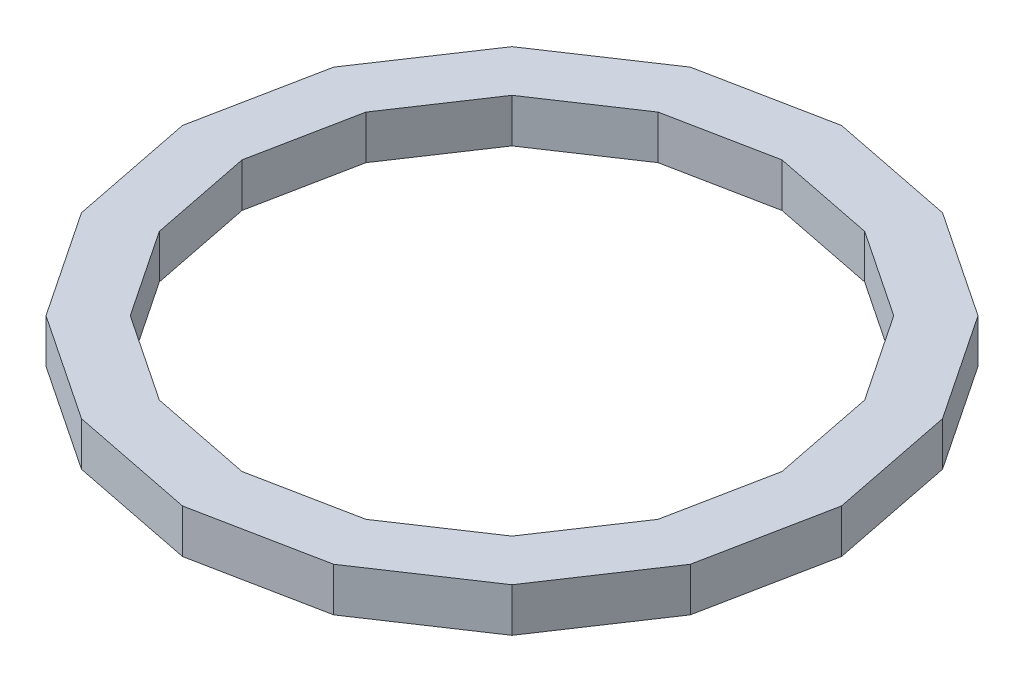
ISO-10303-21;
HEADER;
FILE_DESCRIPTION(('STEP AP214'),'2;1');
FILE_NAME('part.step','',(''),(''),'','','');
FILE_SCHEMA(('AUTOMOTIVE_DESIGN { 1 0 10303 214 1 1 1 1 }'));
ENDSEC;
DATA;
#1=APPLICATION_CONTEXT('core data for automotive mechanical design processes');
#2=APPLICATION_PROTOCOL_DEFINITION('international standard','automotive_design',2000,#1);
#3=PRODUCT_CONTEXT('',#1,'mechanical');
#4=PRODUCT('Part','Part','',(#3));
#5=PRODUCT_RELATED_PRODUCT_CATEGORY('part','',(#4));
#6=PRODUCT_DEFINITION_FORMATION('','',#4);
#7=PRODUCT_DEFINITION_CONTEXT('part definition',#1,'design');
#8=PRODUCT_DEFINITION('design','',#6,#7);
#9=PRODUCT_DEFINITION_SHAPE('','',#8);
#10=(LENGTH_UNIT() NAMED_UNIT(*) SI_UNIT(.MILLI.,.METRE.));
#11=(NAMED_UNIT(*) PLANE_ANGLE_UNIT() SI_UNIT($,.RADIAN.));
#12=(NAMED_UNIT(*) SI_UNIT($,.STERADIAN.) SOLID_ANGLE_UNIT());
#13=UNCERTAINTY_MEASURE_WITH_UNIT(LENGTH_MEASURE(1.E-05),#10,'distance_accuracy_value','');
#14=(GEOMETRIC_REPRESENTATION_CONTEXT(3) GLOBAL_UNCERTAINTY_ASSIGNED_CONTEXT((#13)) GLOBAL_UNIT_ASSIGNED_CONTEXT((#10,
#11,#12)) REPRESENTATION_CONTEXT('',''));
#15=CARTESIAN_POINT('',(0.,0.,0.));
#16=DIRECTION('',(0.,0.,1.));
#17=DIRECTION('',(1.,0.,0.));
#18=AXIS2_PLACEMENT_3D('',#15,#16,#17);
#19=CARTESIAN_POINT('',(0.,19.05,0.));
#20=DIRECTION('',(0.,1.,0.));
#21=DIRECTION('',(0.,0.,1.));
#22=AXIS2_PLACEMENT_3D('',#19,#20,#21);
#23=PLANE('',#22);
#24=DIRECTION('',(0.195090322016119,0.,-0.980785280403232));
#25=VECTOR('',#24,1.);
#26=CARTESIAN_POINT('',(132.314068025535,19.05,54.8062814689311));
#27=LINE('',#26,#25);
#28=CARTESIAN_POINT('',(132.314068025535,19.05,54.8062814689311));
#29=VERTEX_POINT('',#28);
#30=CARTESIAN_POINT('',(143.215715219795,19.05,-1.33227912968946E-12));
#31=VERTEX_POINT('',#30);
#32=EDGE_CURVE('E387',#29,#31,#27,.T.);
#33=ORIENTED_EDGE('',*,*,#32,.T.);
#34=DIRECTION('',(-0.195090322016138,0.,-0.980785280403229));
#35=VECTOR('',#34,1.);
#36=CARTESIAN_POINT('',(143.215715219795,19.05,-1.33227912968946E-12));
#37=LINE('',#36,#35);
#38=CARTESIAN_POINT('',(132.314068025533,19.05,-54.8062814689337));
#39=VERTEX_POINT('',#38);
#40=EDGE_CURVE('E391',#31,#39,#37,.T.);
#41=ORIENTED_EDGE('',*,*,#40,.T.);
#42=DIRECTION('',(-0.555570233019611,0.,-0.83146961230254));
#43=VECTOR('',#42,1.);
#44=CARTESIAN_POINT('',(132.314068025533,19.05,-54.8062814689337));
#45=LINE('',#44,#43);
#46=CARTESIAN_POINT('',(101.268803404398,19.05,-101.2688034044));
#47=VERTEX_POINT('',#46);
#48=EDGE_CURVE('E395',#39,#47,#45,.T.);
#49=ORIENTED_EDGE('',*,*,#48,.T.);
#50=DIRECTION('',(-0.831469612302551,0.,-0.555570233019594));
#51=VECTOR('',#50,1.);
#52=CARTESIAN_POINT('',(101.268803404398,19.05,-101.2688034044));
#53=LINE('',#52,#51);
#54=CARTESIAN_POINT('',(54.8062814689311,19.05,-132.314068025534));
#55=VERTEX_POINT('',#54);
#56=EDGE_CURVE('E398',#47,#55,#53,.T.);
#57=ORIENTED_EDGE('',*,*,#56,.T.);
#58=DIRECTION('',(-0.980785280403233,0.,-0.195090322016118));
#59=VECTOR('',#58,1.);
#60=CARTESIAN_POINT('',(54.8062814689311,19.05,-132.314068025534));
#61=LINE('',#60,#59);
#62=CARTESIAN_POINT('',(-1.41502138351388E-12,19.05,-143.215715219795));
#63=VERTEX_POINT('',#62);
#64=EDGE_CURVE('E401',#55,#63,#61,.T.);
#65=ORIENTED_EDGE('',*,*,#64,.T.);
#66=DIRECTION('',(-0.980785280403229,0.,0.195090322016138));
#67=VECTOR('',#66,1.);
#68=CARTESIAN_POINT('',(-1.41502138351388E-12,19.05,-143.215715219795));
#69=LINE('',#68,#67);
#70=CARTESIAN_POINT('',(-54.8062814689337,19.05,-132.314068025533));
#71=VERTEX_POINT('',#70);
#72=EDGE_CURVE('E404',#63,#71,#69,.T.);
#73=ORIENTED_EDGE('',*,*,#72,.T.);
#74=DIRECTION('',(-0.83146961230254,0.,0.55557023301961));
#75=VECTOR('',#74,1.);
#76=CARTESIAN_POINT('',(-54.8062814689337,19.05,-132.314068025533));
#77=LINE('',#76,#75);
#78=CARTESIAN_POINT('',(-101.2688034044,19.05,-101.268803404398));
#79=VERTEX_POINT('',#78);
#80=EDGE_CURVE('E406',#71,#79,#77,.T.);
#81=ORIENTED_EDGE('',*,*,#80,.T.);
#82=DIRECTION('',(-0.555570233019594,0.,0.831469612302551));
#83=VECTOR('',#82,1.);
#84=CARTESIAN_POINT('',(-101.2688034044,19.05,-101.268803404398));
#85=LINE('',#84,#83);
#86=CARTESIAN_POINT('',(-132.314068025534,19.05,-54.806281468931));
#87=VERTEX_POINT('',#86);
#88=EDGE_CURVE('E408',#79,#87,#85,.T.);
#89=ORIENTED_EDGE('',*,*,#88,.T.);
#90=DIRECTION('',(-0.195090322016118,0.,0.980785280403233));
#91=VECTOR('',#90,1.);
#92=CARTESIAN_POINT('',(-132.314068025534,19.05,-54.806281468931));
#93=LINE('',#92,#91);
#94=CARTESIAN_POINT('',(-143.215715219795,19.05,1.47046340656723E-12));
#95=VERTEX_POINT('',#94);
#96=EDGE_CURVE('E410',#87,#95,#93,.T.);
#97=ORIENTED_EDGE('',*,*,#96,.T.);
#98=DIRECTION('',(0.195090322016138,0.,0.980785280403229));
#99=VECTOR('',#98,1.);
#100=CARTESIAN_POINT('',(-143.215715219795,19.05,1.47046340656723E-12));
#101=LINE('',#100,#99);
#102=CARTESIAN_POINT('',(-132.314068025533,19.05,54.8062814689337));
#103=VERTEX_POINT('',#102);
#104=EDGE_CURVE('E412',#95,#103,#101,.T.);
#105=ORIENTED_EDGE('',*,*,#104,.T.);
#106=DIRECTION('',(0.555570233019611,0.,0.83146961230254));
#107=VECTOR('',#106,1.);
#108=CARTESIAN_POINT('',(-132.314068025533,19.05,54.8062814689337));
#109=LINE('',#108,#107);
#110=CARTESIAN_POINT('',(-101.268803404398,19.05,101.2688034044));
#111=VERTEX_POINT('',#110);
#112=EDGE_CURVE('E414',#103,#111,#109,.T.);
#113=ORIENTED_EDGE('',*,*,#112,.T.);
#114=DIRECTION('',(0.831469612302551,0.,0.555570233019594));
#115=VECTOR('',#114,1.);
#116=CARTESIAN_POINT('',(-101.268803404398,19.05,101.2688034044));
#117=LINE('',#116,#115);
#118=CARTESIAN_POINT('',(-54.8062814689311,19.05,132.314068025534));
#119=VERTEX_POINT('',#118);
#120=EDGE_CURVE('E416',#111,#119,#117,.T.);
#121=ORIENTED_EDGE('',*,*,#120,.T.);
#122=DIRECTION('',(0.980785280403233,0.,0.195090322016118));
#123=VECTOR('',#122,1.);
#124=CARTESIAN_POINT('',(-54.8062814689311,19.05,132.314068025534));
#125=LINE('',#124,#123);
#126=CARTESIAN_POINT('',(1.44060583007305E-12,19.05,143.215715219795));
#127=VERTEX_POINT('',#126);
#128=EDGE_CURVE('E418',#119,#127,#125,.T.);
#129=ORIENTED_EDGE('',*,*,#128,.T.);
#130=DIRECTION('',(0.980785280403229,0.,-0.195090322016138));
#131=VECTOR('',#130,1.);
#132=CARTESIAN_POINT('',(1.44060583007305E-12,19.05,143.215715219795));
#133=LINE('',#132,#131);
#134=CARTESIAN_POINT('',(54.8062814689338,19.05,132.314068025533));
#135=VERTEX_POINT('',#134);
#136=EDGE_CURVE('E420',#127,#135,#133,.T.);
#137=ORIENTED_EDGE('',*,*,#136,.T.);
#138=DIRECTION('',(0.83146961230254,0.,-0.555570233019611));
#139=VECTOR('',#138,1.);
#140=CARTESIAN_POINT('',(54.8062814689338,19.05,132.314068025533));
#141=LINE('',#140,#139);
#142=CARTESIAN_POINT('',(101.2688034044,19.05,101.268803404398));
#143=VERTEX_POINT('',#142);
#144=EDGE_CURVE('E422',#135,#143,#141,.T.);
#145=ORIENTED_EDGE('',*,*,#144,.T.);
#146=DIRECTION('',(0.555570233019594,0.,-0.831469612302551));
#147=VECTOR('',#146,1.);
#148=CARTESIAN_POINT('',(101.2688034044,19.05,101.268803404398));
#149=LINE('',#148,#147);
#150=EDGE_CURVE('E424',#143,#29,#149,.T.);
#151=ORIENTED_EDGE('',*,*,#150,.T.);
#152=EDGE_LOOP('',(#33,#41,#49,#57,#65,#73,#81,#89,#97,#105,#113,#121,#129,#137,#145,#151));
#153=FACE_BOUND('',#152,.T.);
#154=DIRECTION('',(-0.195090322016138,0.,-0.980785280403228));
#155=VECTOR('',#154,1.);
#156=CARTESIAN_POINT('',(117.318099801304,19.05,-1.27657928212033E-12));
#157=LINE('',#156,#155);
#158=CARTESIAN_POINT('',(117.318099801304,19.05,-1.27657928212033E-12));
#159=VERTEX_POINT('',#158);
#160=CARTESIAN_POINT('',(108.387791199541,19.05,-44.8956931105142));
#161=VERTEX_POINT('',#160);
#162=EDGE_CURVE('E252',#159,#161,#157,.T.);
#163=ORIENTED_EDGE('',*,*,#162,.F.);
#164=DIRECTION('',(0.195090322016118,0.,-0.980785280403233));
#165=VECTOR('',#164,1.);
#166=CARTESIAN_POINT('',(108.387791199542,19.05,44.8956931105121));
#167=LINE('',#166,#165);
#168=CARTESIAN_POINT('',(108.387791199542,19.05,44.8956931105121));
#169=VERTEX_POINT('',#168);
#170=EDGE_CURVE('E244',#169,#159,#167,.T.);
#171=ORIENTED_EDGE('',*,*,#170,.F.);
#172=DIRECTION('',(0.555570233019594,0.,-0.831469612302551));
#173=VECTOR('',#172,1.);
#174=CARTESIAN_POINT('',(82.956423925423,19.05,82.9564239254212));
#175=LINE('',#174,#173);
#176=CARTESIAN_POINT('',(82.956423925423,19.05,82.9564239254212));
#177=VERTEX_POINT('',#176);
#178=EDGE_CURVE('E303',#177,#169,#175,.T.);
#179=ORIENTED_EDGE('',*,*,#178,.F.);
#180=DIRECTION('',(0.83146961230254,0.,-0.555570233019611));
#181=VECTOR('',#180,1.);
#182=CARTESIAN_POINT('',(44.8956931105142,19.05,108.387791199541));
#183=LINE('',#182,#181);
#184=CARTESIAN_POINT('',(44.8956931105142,19.05,108.387791199541));
#185=VERTEX_POINT('',#184);
#186=EDGE_CURVE('E300',#185,#177,#183,.T.);
#187=ORIENTED_EDGE('',*,*,#186,.F.);
#188=DIRECTION('',(0.980785280403228,0.,-0.195090322016138));
#189=VECTOR('',#188,1.);
#190=CARTESIAN_POINT('',(1.22266987130559E-12,19.05,117.318099801304));
#191=LINE('',#190,#189);
#192=CARTESIAN_POINT('',(1.22266987130559E-12,19.05,117.318099801304));
#193=VERTEX_POINT('',#192);
#194=EDGE_CURVE('E298',#193,#185,#191,.T.);
#195=ORIENTED_EDGE('',*,*,#194,.F.);
#196=DIRECTION('',(0.980785280403232,0.,0.195090322016118));
#197=VECTOR('',#196,1.);
#198=CARTESIAN_POINT('',(-44.895693110512,19.05,108.387791199542));
#199=LINE('',#198,#197);
#200=CARTESIAN_POINT('',(-44.895693110512,19.05,108.387791199542));
#201=VERTEX_POINT('',#200);
#202=EDGE_CURVE('E296',#201,#193,#199,.T.);
#203=ORIENTED_EDGE('',*,*,#202,.F.);
#204=DIRECTION('',(0.831469612302551,0.,0.555570233019594));
#205=VECTOR('',#204,1.);
#206=CARTESIAN_POINT('',(-82.9564239254213,19.05,82.956423925423));
#207=LINE('',#206,#205);
#208=CARTESIAN_POINT('',(-82.9564239254213,19.05,82.956423925423));
#209=VERTEX_POINT('',#208);
#210=EDGE_CURVE('E293',#209,#201,#207,.T.);
#211=ORIENTED_EDGE('',*,*,#210,.F.);
#212=DIRECTION('',(0.555570233019611,0.,0.831469612302539));
#213=VECTOR('',#212,1.);
#214=CARTESIAN_POINT('',(-108.387791199541,19.05,44.8956931105142));
#215=LINE('',#214,#213);
#216=CARTESIAN_POINT('',(-108.387791199541,19.05,44.8956931105142));
#217=VERTEX_POINT('',#216);
#218=EDGE_CURVE('E291',#217,#209,#215,.T.);
#219=ORIENTED_EDGE('',*,*,#218,.F.);
#220=DIRECTION('',(0.195090322016138,0.,0.980785280403228));
#221=VECTOR('',#220,1.);
#222=CARTESIAN_POINT('',(-117.318099801304,19.05,1.28933217815806E-12));
#223=LINE('',#222,#221);
#224=CARTESIAN_POINT('',(-117.318099801304,19.05,1.28933217815806E-12));
#225=VERTEX_POINT('',#224);
#226=EDGE_CURVE('E289',#225,#217,#223,.T.);
#227=ORIENTED_EDGE('',*,*,#226,.F.);
#228=DIRECTION('',(-0.195090322016118,0.,0.980785280403233));
#229=VECTOR('',#228,1.);
#230=CARTESIAN_POINT('',(-108.387791199542,19.05,-44.895693110512));
#231=LINE('',#230,#229);
#232=CARTESIAN_POINT('',(-108.387791199542,19.05,-44.895693110512));
#233=VERTEX_POINT('',#232);
#234=EDGE_CURVE('E287',#233,#225,#231,.T.);
#235=ORIENTED_EDGE('',*,*,#234,.F.);
#236=DIRECTION('',(-0.555570233019594,0.,0.831469612302551));
#237=VECTOR('',#236,1.);
#238=CARTESIAN_POINT('',(-82.9564239254229,19.05,-82.9564239254212));
#239=LINE('',#238,#237);
#240=CARTESIAN_POINT('',(-82.9564239254229,19.05,-82.9564239254212));
#241=VERTEX_POINT('',#240);
#242=EDGE_CURVE('E285',#241,#233,#239,.T.);
#243=ORIENTED_EDGE('',*,*,#242,.F.);
#244=DIRECTION('',(-0.831469612302539,0.,0.555570233019611));
#245=VECTOR('',#244,1.);
#246=CARTESIAN_POINT('',(-44.8956931105143,19.05,-108.387791199541));
#247=LINE('',#246,#245);
#248=CARTESIAN_POINT('',(-44.8956931105143,19.05,-108.387791199541));
#249=VERTEX_POINT('',#248);
#250=EDGE_CURVE('E283',#249,#241,#247,.T.);
#251=ORIENTED_EDGE('',*,*,#250,.F.);
#252=DIRECTION('',(-0.980785280403229,0.,0.195090322016138));
#253=VECTOR('',#252,1.);
#254=CARTESIAN_POINT('',(-1.26404060994794E-12,19.05,-117.318099801304));
#255=LINE('',#254,#253);
#256=CARTESIAN_POINT('',(-1.26404060994794E-12,19.05,-117.318099801304));
#257=VERTEX_POINT('',#256);
#258=EDGE_CURVE('E281',#257,#249,#255,.T.);
#259=ORIENTED_EDGE('',*,*,#258,.F.);
#260=DIRECTION('',(-0.980785280403233,0.,-0.195090322016118));
#261=VECTOR('',#260,1.);
#262=CARTESIAN_POINT('',(44.8956931105121,19.05,-108.387791199541));
#263=LINE('',#262,#261);
#264=CARTESIAN_POINT('',(44.8956931105121,19.05,-108.387791199541));
#265=VERTEX_POINT('',#264);
#266=EDGE_CURVE('E278',#265,#257,#263,.T.);
#267=ORIENTED_EDGE('',*,*,#266,.F.);
#268=DIRECTION('',(-0.831469612302551,0.,-0.555570233019594));
#269=VECTOR('',#268,1.);
#270=CARTESIAN_POINT('',(82.9564239254212,19.05,-82.956423925423));
#271=LINE('',#270,#269);
#272=CARTESIAN_POINT('',(82.9564239254212,19.05,-82.956423925423));
#273=VERTEX_POINT('',#272);
#274=EDGE_CURVE('E273',#273,#265,#271,.T.);
#275=ORIENTED_EDGE('',*,*,#274,.F.);
#276=DIRECTION('',(-0.555570233019611,0.,-0.831469612302539));
#277=VECTOR('',#276,1.);
#278=CARTESIAN_POINT('',(108.387791199541,19.05,-44.8956931105142));
#279=LINE('',#278,#277);
#280=EDGE_CURVE('E266',#161,#273,#279,.T.);
#281=ORIENTED_EDGE('',*,*,#280,.F.);
#282=EDGE_LOOP('',(#163,#171,#179,#187,#195,#203,#211,#219,#227,#235,#243,#251,#259,#267,#275,#281));
#283=FACE_BOUND('',#282,.T.);
#284=ADVANCED_FACE('F35',(#153,#283),#23,.T.);
#285=CARTESIAN_POINT('',(0.,0.,0.));
#286=DIRECTION('',(0.,1.,0.));
#287=DIRECTION('',(0.,0.,1.));
#288=AXIS2_PLACEMENT_3D('',#285,#286,#287);
#289=PLANE('',#288);
#290=DIRECTION('',(0.195090322016119,0.,-0.980785280403232));
#291=VECTOR('',#290,1.);
#292=CARTESIAN_POINT('',(132.314068025535,0.,54.8062814689311));
#293=LINE('',#292,#291);
#294=CARTESIAN_POINT('',(132.314068025535,0.,54.8062814689311));
#295=VERTEX_POINT('',#294);
#296=CARTESIAN_POINT('',(143.215715219795,0.,-1.33227912968946E-12));
#297=VERTEX_POINT('',#296);
#298=EDGE_CURVE('E261',#295,#297,#293,.T.);
#299=ORIENTED_EDGE('',*,*,#298,.F.);
#300=DIRECTION('',(0.555570233019594,0.,-0.831469612302551));
#301=VECTOR('',#300,1.);
#302=CARTESIAN_POINT('',(101.2688034044,0.,101.268803404398));
#303=LINE('',#302,#301);
#304=CARTESIAN_POINT('',(101.2688034044,0.,101.268803404398));
#305=VERTEX_POINT('',#304);
#306=EDGE_CURVE('E392',#305,#295,#303,.T.);
#307=ORIENTED_EDGE('',*,*,#306,.F.);
#308=DIRECTION('',(0.83146961230254,0.,-0.555570233019611));
#309=VECTOR('',#308,1.);
#310=CARTESIAN_POINT('',(54.8062814689338,0.,132.314068025533));
#311=LINE('',#310,#309);
#312=CARTESIAN_POINT('',(54.8062814689338,0.,132.314068025533));
#313=VERTEX_POINT('',#312);
#314=EDGE_CURVE('E466',#313,#305,#311,.T.);
#315=ORIENTED_EDGE('',*,*,#314,.F.);
#316=DIRECTION('',(0.980785280403229,0.,-0.195090322016138));
#317=VECTOR('',#316,1.);
#318=CARTESIAN_POINT('',(1.44060583007305E-12,0.,143.215715219795));
#319=LINE('',#318,#317);
#320=CARTESIAN_POINT('',(1.44060583007305E-12,0.,143.215715219795));
#321=VERTEX_POINT('',#320);
#322=EDGE_CURVE('E463',#321,#313,#319,.T.);
#323=ORIENTED_EDGE('',*,*,#322,.F.);
#324=DIRECTION('',(0.980785280403233,0.,0.195090322016118));
#325=VECTOR('',#324,1.);
#326=CARTESIAN_POINT('',(-54.8062814689311,0.,132.314068025534));
#327=LINE('',#326,#325);
#328=CARTESIAN_POINT('',(-54.8062814689311,0.,132.314068025534));
#329=VERTEX_POINT('',#328);
#330=EDGE_CURVE('E460',#329,#321,#327,.T.);
#331=ORIENTED_EDGE('',*,*,#330,.F.);
#332=DIRECTION('',(0.831469612302551,0.,0.555570233019594));
#333=VECTOR('',#332,1.);
#334=CARTESIAN_POINT('',(-101.268803404398,0.,101.2688034044));
#335=LINE('',#334,#333);
#336=CARTESIAN_POINT('',(-101.268803404398,0.,101.2688034044));
#337=VERTEX_POINT('',#336);
#338=EDGE_CURVE('E457',#337,#329,#335,.T.);
#339=ORIENTED_EDGE('',*,*,#338,.F.);
#340=DIRECTION('',(0.555570233019611,0.,0.83146961230254));
#341=VECTOR('',#340,1.);
#342=CARTESIAN_POINT('',(-132.314068025533,0.,54.8062814689337));
#343=LINE('',#342,#341);
#344=CARTESIAN_POINT('',(-132.314068025533,0.,54.8062814689337));
#345=VERTEX_POINT('',#344);
#346=EDGE_CURVE('E454',#345,#337,#343,.T.);
#347=ORIENTED_EDGE('',*,*,#346,.F.);
#348=DIRECTION('',(0.195090322016138,0.,0.980785280403229));
#349=VECTOR('',#348,1.);
#350=CARTESIAN_POINT('',(-143.215715219795,0.,1.47046340656723E-12));
#351=LINE('',#350,#349);
#352=CARTESIAN_POINT('',(-143.215715219795,0.,1.47046340656723E-12));
#353=VERTEX_POINT('',#352);
#354=EDGE_CURVE('E452',#353,#345,#351,.T.);
#355=ORIENTED_EDGE('',*,*,#354,.F.);
#356=DIRECTION('',(-0.195090322016118,0.,0.980785280403233));
#357=VECTOR('',#356,1.);
#358=CARTESIAN_POINT('',(-132.314068025534,0.,-54.806281468931));
#359=LINE('',#358,#357);
#360=CARTESIAN_POINT('',(-132.314068025534,0.,-54.806281468931));
#361=VERTEX_POINT('',#360);
#362=EDGE_CURVE('E449',#361,#353,#359,.T.);
#363=ORIENTED_EDGE('',*,*,#362,.F.);
#364=DIRECTION('',(-0.555570233019594,0.,0.831469612302551));
#365=VECTOR('',#364,1.);
#366=CARTESIAN_POINT('',(-101.2688034044,0.,-101.268803404398));
#367=LINE('',#366,#365);
#368=CARTESIAN_POINT('',(-101.2688034044,0.,-101.268803404398));
#369=VERTEX_POINT('',#368);
#370=EDGE_CURVE('E447',#369,#361,#367,.T.);
#371=ORIENTED_EDGE('',*,*,#370,.F.);
#372=DIRECTION('',(-0.83146961230254,0.,0.55557023301961));
#373=VECTOR('',#372,1.);
#374=CARTESIAN_POINT('',(-54.8062814689337,0.,-132.314068025533));
#375=LINE('',#374,#373);
#376=CARTESIAN_POINT('',(-54.8062814689337,0.,-132.314068025533));
#377=VERTEX_POINT('',#376);
#378=EDGE_CURVE('E445',#377,#369,#375,.T.);
#379=ORIENTED_EDGE('',*,*,#378,.F.);
#380=DIRECTION('',(-0.980785280403229,0.,0.195090322016138));
#381=VECTOR('',#380,1.);
#382=CARTESIAN_POINT('',(-1.41502138351388E-12,0.,-143.215715219795));
#383=LINE('',#382,#381);
#384=CARTESIAN_POINT('',(-1.41502138351388E-12,0.,-143.215715219795));
#385=VERTEX_POINT('',#384);
#386=EDGE_CURVE('E443',#385,#377,#383,.T.);
#387=ORIENTED_EDGE('',*,*,#386,.F.);
#388=DIRECTION('',(-0.980785280403233,0.,-0.195090322016118));
#389=VECTOR('',#388,1.);
#390=CARTESIAN_POINT('',(54.8062814689311,0.,-132.314068025534));
#391=LINE('',#390,#389);
#392=CARTESIAN_POINT('',(54.8062814689311,0.,-132.314068025534));
#393=VERTEX_POINT('',#392);
#394=EDGE_CURVE('E440',#393,#385,#391,.T.);
#395=ORIENTED_EDGE('',*,*,#394,.F.);
#396=DIRECTION('',(-0.831469612302551,0.,-0.555570233019594));
#397=VECTOR('',#396,1.);
#398=CARTESIAN_POINT('',(101.268803404398,0.,-101.2688034044));
#399=LINE('',#398,#397);
#400=CARTESIAN_POINT('',(101.268803404398,0.,-101.2688034044));
#401=VERTEX_POINT('',#400);
#402=EDGE_CURVE('E437',#401,#393,#399,.T.);
#403=ORIENTED_EDGE('',*,*,#402,.F.);
#404=DIRECTION('',(-0.555570233019611,0.,-0.83146961230254));
#405=VECTOR('',#404,1.);
#406=CARTESIAN_POINT('',(132.314068025533,0.,-54.8062814689337));
#407=LINE('',#406,#405);
#408=CARTESIAN_POINT('',(132.314068025533,0.,-54.8062814689337));
#409=VERTEX_POINT('',#408);
#410=EDGE_CURVE('E434',#409,#401,#407,.T.);
#411=ORIENTED_EDGE('',*,*,#410,.F.);
#412=DIRECTION('',(-0.195090322016138,0.,-0.980785280403229));
#413=VECTOR('',#412,1.);
#414=CARTESIAN_POINT('',(143.215715219795,0.,-1.33227912968946E-12));
#415=LINE('',#414,#413);
#416=EDGE_CURVE('E431',#297,#409,#415,.T.);
#417=ORIENTED_EDGE('',*,*,#416,.F.);
#418=EDGE_LOOP('',(#299,#307,#315,#323,#331,#339,#347,#355,#363,#371,#379,#387,#395,#403,#411,#417));
#419=FACE_BOUND('',#418,.T.);
#420=DIRECTION('',(0.195090322016118,0.,-0.980785280403233));
#421=VECTOR('',#420,1.);
#422=CARTESIAN_POINT('',(108.387791199542,0.,44.8956931105121));
#423=LINE('',#422,#421);
#424=CARTESIAN_POINT('',(108.387791199542,0.,44.8956931105121));
#425=VERTEX_POINT('',#424);
#426=CARTESIAN_POINT('',(117.318099801304,0.,-1.27657928212033E-12));
#427=VERTEX_POINT('',#426);
#428=EDGE_CURVE('E58',#425,#427,#423,.T.);
#429=ORIENTED_EDGE('',*,*,#428,.T.);
#430=DIRECTION('',(-0.195090322016138,0.,-0.980785280403228));
#431=VECTOR('',#430,1.);
#432=CARTESIAN_POINT('',(117.318099801304,0.,-1.27657928212033E-12));
#433=LINE('',#432,#431);
#434=CARTESIAN_POINT('',(108.387791199541,0.,-44.8956931105142));
#435=VERTEX_POINT('',#434);
#436=EDGE_CURVE('E259',#427,#435,#433,.T.);
#437=ORIENTED_EDGE('',*,*,#436,.T.);
#438=DIRECTION('',(-0.555570233019611,0.,-0.831469612302539));
#439=VECTOR('',#438,1.);
#440=CARTESIAN_POINT('',(108.387791199541,0.,-44.8956931105142));
#441=LINE('',#440,#439);
#442=CARTESIAN_POINT('',(82.9564239254212,0.,-82.956423925423));
#443=VERTEX_POINT('',#442);
#444=EDGE_CURVE('E310',#435,#443,#441,.T.);
#445=ORIENTED_EDGE('',*,*,#444,.T.);
#446=DIRECTION('',(-0.831469612302551,0.,-0.555570233019594));
#447=VECTOR('',#446,1.);
#448=CARTESIAN_POINT('',(82.9564239254212,0.,-82.956423925423));
#449=LINE('',#448,#447);
#450=CARTESIAN_POINT('',(44.8956931105121,0.,-108.387791199541));
#451=VERTEX_POINT('',#450);
#452=EDGE_CURVE('E314',#443,#451,#449,.T.);
#453=ORIENTED_EDGE('',*,*,#452,.T.);
#454=DIRECTION('',(-0.980785280403233,0.,-0.195090322016118));
#455=VECTOR('',#454,1.);
#456=CARTESIAN_POINT('',(44.8956931105121,0.,-108.387791199541));
#457=LINE('',#456,#455);
#458=CARTESIAN_POINT('',(-1.26404060994794E-12,0.,-117.318099801304));
#459=VERTEX_POINT('',#458);
#460=EDGE_CURVE('E318',#451,#459,#457,.T.);
#461=ORIENTED_EDGE('',*,*,#460,.T.);
#462=DIRECTION('',(-0.980785280403229,0.,0.195090322016138));
#463=VECTOR('',#462,1.);
#464=CARTESIAN_POINT('',(-1.26404060994794E-12,0.,-117.318099801304));
#465=LINE('',#464,#463);
#466=CARTESIAN_POINT('',(-44.8956931105143,0.,-108.387791199541));
#467=VERTEX_POINT('',#466);
#468=EDGE_CURVE('E322',#459,#467,#465,.T.);
#469=ORIENTED_EDGE('',*,*,#468,.T.);
#470=DIRECTION('',(-0.831469612302539,0.,0.555570233019611));
#471=VECTOR('',#470,1.);
#472=CARTESIAN_POINT('',(-44.8956931105143,0.,-108.387791199541));
#473=LINE('',#472,#471);
#474=CARTESIAN_POINT('',(-82.9564239254229,0.,-82.9564239254212));
#475=VERTEX_POINT('',#474);
#476=EDGE_CURVE('E325',#467,#475,#473,.T.);
#477=ORIENTED_EDGE('',*,*,#476,.T.);
#478=DIRECTION('',(-0.555570233019594,0.,0.831469612302551));
#479=VECTOR('',#478,1.);
#480=CARTESIAN_POINT('',(-82.9564239254229,0.,-82.9564239254212));
#481=LINE('',#480,#479);
#482=CARTESIAN_POINT('',(-108.387791199542,0.,-44.895693110512));
#483=VERTEX_POINT('',#482);
#484=EDGE_CURVE('E329',#475,#483,#481,.T.);
#485=ORIENTED_EDGE('',*,*,#484,.T.);
#486=DIRECTION('',(-0.195090322016118,0.,0.980785280403233));
#487=VECTOR('',#486,1.);
#488=CARTESIAN_POINT('',(-108.387791199542,0.,-44.895693110512));
#489=LINE('',#488,#487);
#490=CARTESIAN_POINT('',(-117.318099801304,0.,1.28933217815806E-12));
#491=VERTEX_POINT('',#490);
#492=EDGE_CURVE('E332',#483,#491,#489,.T.);
#493=ORIENTED_EDGE('',*,*,#492,.T.);
#494=DIRECTION('',(0.195090322016138,0.,0.980785280403228));
#495=VECTOR('',#494,1.);
#496=CARTESIAN_POINT('',(-117.318099801304,0.,1.28933217815806E-12));
#497=LINE('',#496,#495);
#498=CARTESIAN_POINT('',(-108.387791199541,0.,44.8956931105142));
#499=VERTEX_POINT('',#498);
#500=EDGE_CURVE('E336',#491,#499,#497,.T.);
#501=ORIENTED_EDGE('',*,*,#500,.T.);
#502=DIRECTION('',(0.555570233019611,0.,0.831469612302539));
#503=VECTOR('',#502,1.);
#504=CARTESIAN_POINT('',(-108.387791199541,0.,44.8956931105142));
#505=LINE('',#504,#503);
#506=CARTESIAN_POINT('',(-82.9564239254213,0.,82.956423925423));
#507=VERTEX_POINT('',#506);
#508=EDGE_CURVE('E339',#499,#507,#505,.T.);
#509=ORIENTED_EDGE('',*,*,#508,.T.);
#510=DIRECTION('',(0.831469612302551,0.,0.555570233019594));
#511=VECTOR('',#510,1.);
#512=CARTESIAN_POINT('',(-82.9564239254213,0.,82.956423925423));
#513=LINE('',#512,#511);
#514=CARTESIAN_POINT('',(-44.895693110512,0.,108.387791199542));
#515=VERTEX_POINT('',#514);
#516=EDGE_CURVE('E343',#507,#515,#513,.T.);
#517=ORIENTED_EDGE('',*,*,#516,.T.);
#518=DIRECTION('',(0.980785280403232,0.,0.195090322016118));
#519=VECTOR('',#518,1.);
#520=CARTESIAN_POINT('',(-44.895693110512,0.,108.387791199542));
#521=LINE('',#520,#519);
#522=CARTESIAN_POINT('',(1.22266987130559E-12,0.,117.318099801304));
#523=VERTEX_POINT('',#522);
#524=EDGE_CURVE('E346',#515,#523,#521,.T.);
#525=ORIENTED_EDGE('',*,*,#524,.T.);
#526=DIRECTION('',(0.980785280403228,0.,-0.195090322016138));
#527=VECTOR('',#526,1.);
#528=CARTESIAN_POINT('',(1.22266987130559E-12,0.,117.318099801304));
#529=LINE('',#528,#527);
#530=CARTESIAN_POINT('',(44.8956931105142,0.,108.387791199541));
#531=VERTEX_POINT('',#530);
#532=EDGE_CURVE('E349',#523,#531,#529,.T.);
#533=ORIENTED_EDGE('',*,*,#532,.T.);
#534=DIRECTION('',(0.83146961230254,0.,-0.555570233019611));
#535=VECTOR('',#534,1.);
#536=CARTESIAN_POINT('',(44.8956931105142,0.,108.387791199541));
#537=LINE('',#536,#535);
#538=CARTESIAN_POINT('',(82.956423925423,0.,82.9564239254212));
#539=VERTEX_POINT('',#538);
#540=EDGE_CURVE('E352',#531,#539,#537,.T.);
#541=ORIENTED_EDGE('',*,*,#540,.T.);
#542=DIRECTION('',(0.555570233019594,0.,-0.831469612302551));
#543=VECTOR('',#542,1.);
#544=CARTESIAN_POINT('',(82.956423925423,0.,82.9564239254212));
#545=LINE('',#544,#543);
#546=EDGE_CURVE('E253',#539,#425,#545,.T.);
#547=ORIENTED_EDGE('',*,*,#546,.T.);
#548=EDGE_LOOP('',(#429,#437,#445,#453,#461,#469,#477,#485,#493,#501,#509,#517,#525,#533,#541,#547));
#549=FACE_BOUND('',#548,.T.);
#550=ADVANCED_FACE('F528',(#419,#549),#289,.F.);
#551=CARTESIAN_POINT('',(132.314068025535,19.05,54.8062814689311));
#552=DIRECTION('',(-0.980785280403232,0.,-0.195090322016119));
#553=DIRECTION('',(-0.195090322016119,0.,0.980785280403232));
#554=AXIS2_PLACEMENT_3D('',#551,#552,#553);
#555=PLANE('',#554);
#556=ORIENTED_EDGE('',*,*,#298,.T.);
#557=DIRECTION('',(0.,-1.,0.));
#558=VECTOR('',#557,1.);
#559=CARTESIAN_POINT('',(143.215715219795,19.05,-1.33227912968946E-12));
#560=LINE('',#559,#558);
#561=EDGE_CURVE('E11',#31,#297,#560,.T.);
#562=ORIENTED_EDGE('',*,*,#561,.F.);
#563=ORIENTED_EDGE('',*,*,#32,.F.);
#564=DIRECTION('',(0.,-1.,0.));
#565=VECTOR('',#564,1.);
#566=CARTESIAN_POINT('',(132.314068025535,19.05,54.8062814689311));
#567=LINE('',#566,#565);
#568=EDGE_CURVE('E427',#29,#295,#567,.T.);
#569=ORIENTED_EDGE('',*,*,#568,.T.);
#570=EDGE_LOOP('',(#556,#562,#563,#569));
#571=FACE_BOUND('',#570,.T.);
#572=ADVANCED_FACE('F37',(#571),#555,.F.);
#573=CARTESIAN_POINT('',(143.215715219795,19.05,-1.33227912968946E-12));
#574=DIRECTION('',(-0.980785280403228,0.,0.195090322016138));
#575=DIRECTION('',(0.195090322016138,0.,0.980785280403228));
#576=AXIS2_PLACEMENT_3D('',#573,#574,#575);
#577=PLANE('',#576);
#578=ORIENTED_EDGE('',*,*,#416,.T.);
#579=DIRECTION('',(0.,-1.,0.));
#580=VECTOR('',#579,1.);
#581=CARTESIAN_POINT('',(132.314068025533,19.05,-54.8062814689337));
#582=LINE('',#581,#580);
#583=EDGE_CURVE('E43',#39,#409,#582,.T.);
#584=ORIENTED_EDGE('',*,*,#583,.F.);
#585=ORIENTED_EDGE('',*,*,#40,.F.);
#586=ORIENTED_EDGE('',*,*,#561,.T.);
#587=EDGE_LOOP('',(#578,#584,#585,#586));
#588=FACE_BOUND('',#587,.T.);
#589=ADVANCED_FACE('F545',(#588),#577,.F.);
#590=CARTESIAN_POINT('',(132.314068025533,19.05,-54.8062814689337));
#591=DIRECTION('',(-0.83146961230254,0.,0.555570233019611));
#592=DIRECTION('',(0.555570233019611,0.,0.83146961230254));
#593=AXIS2_PLACEMENT_3D('',#590,#591,#592);
#594=PLANE('',#593);
#595=ORIENTED_EDGE('',*,*,#410,.T.);
#596=DIRECTION('',(0.,-1.,0.));
#597=VECTOR('',#596,1.);
#598=CARTESIAN_POINT('',(101.268803404398,19.05,-101.2688034044));
#599=LINE('',#598,#597);
#600=EDGE_CURVE('E511',#47,#401,#599,.T.);
#601=ORIENTED_EDGE('',*,*,#600,.F.);
#602=ORIENTED_EDGE('',*,*,#48,.F.);
#603=ORIENTED_EDGE('',*,*,#583,.T.);
#604=EDGE_LOOP('',(#595,#601,#602,#603));
#605=FACE_BOUND('',#604,.T.);
#606=ADVANCED_FACE('F522',(#605),#594,.F.);
#607=CARTESIAN_POINT('',(101.268803404398,19.05,-101.2688034044));
#608=DIRECTION('',(-0.555570233019594,0.,0.831469612302551));
#609=DIRECTION('',(0.831469612302551,0.,0.555570233019594));
#610=AXIS2_PLACEMENT_3D('',#607,#608,#609);
#611=PLANE('',#610);
#612=ORIENTED_EDGE('',*,*,#402,.T.);
#613=DIRECTION('',(0.,-1.,0.));
#614=VECTOR('',#613,1.);
#615=CARTESIAN_POINT('',(54.8062814689311,19.05,-132.314068025534));
#616=LINE('',#615,#614);
#617=EDGE_CURVE('E507',#55,#393,#616,.T.);
#618=ORIENTED_EDGE('',*,*,#617,.F.);
#619=ORIENTED_EDGE('',*,*,#56,.F.);
#620=ORIENTED_EDGE('',*,*,#600,.T.);
#621=EDGE_LOOP('',(#612,#618,#619,#620));
#622=FACE_BOUND('',#621,.T.);
#623=ADVANCED_FACE('F534',(#622),#611,.F.);
#624=CARTESIAN_POINT('',(54.8062814689311,19.05,-132.314068025534));
#625=DIRECTION('',(-0.195090322016118,0.,0.980785280403232));
#626=DIRECTION('',(0.980785280403232,0.,0.195090322016118));
#627=AXIS2_PLACEMENT_3D('',#624,#625,#626);
#628=PLANE('',#627);
#629=ORIENTED_EDGE('',*,*,#394,.T.);
#630=DIRECTION('',(0.,-1.,0.));
#631=VECTOR('',#630,1.);
#632=CARTESIAN_POINT('',(-1.41502138351388E-12,19.05,-143.215715219795));
#633=LINE('',#632,#631);
#634=EDGE_CURVE('E504',#63,#385,#633,.T.);
#635=ORIENTED_EDGE('',*,*,#634,.F.);
#636=ORIENTED_EDGE('',*,*,#64,.F.);
#637=ORIENTED_EDGE('',*,*,#617,.T.);
#638=EDGE_LOOP('',(#629,#635,#636,#637));
#639=FACE_BOUND('',#638,.T.);
#640=ADVANCED_FACE('F538',(#639),#628,.F.);
#641=CARTESIAN_POINT('',(-1.41502138351388E-12,19.05,-143.215715219795));
#642=DIRECTION('',(0.195090322016138,0.,0.980785280403228));
#643=DIRECTION('',(0.980785280403229,0.,-0.195090322016138));
#644=AXIS2_PLACEMENT_3D('',#641,#642,#643);
#645=PLANE('',#644);
#646=ORIENTED_EDGE('',*,*,#386,.T.);
#647=DIRECTION('',(0.,-1.,0.));
#648=VECTOR('',#647,1.);
#649=CARTESIAN_POINT('',(-54.8062814689337,19.05,-132.314068025533));
#650=LINE('',#649,#648);
#651=EDGE_CURVE('E501',#71,#377,#650,.T.);
#652=ORIENTED_EDGE('',*,*,#651,.F.);
#653=ORIENTED_EDGE('',*,*,#72,.F.);
#654=ORIENTED_EDGE('',*,*,#634,.T.);
#655=EDGE_LOOP('',(#646,#652,#653,#654));
#656=FACE_BOUND('',#655,.T.);
#657=ADVANCED_FACE('F598',(#656),#645,.F.);
#658=CARTESIAN_POINT('',(-54.8062814689337,19.05,-132.314068025533));
#659=DIRECTION('',(0.55557023301961,0.,0.83146961230254));
#660=DIRECTION('',(0.83146961230254,0.,-0.55557023301961));
#661=AXIS2_PLACEMENT_3D('',#658,#659,#660);
#662=PLANE('',#661);
#663=ORIENTED_EDGE('',*,*,#378,.T.);
#664=DIRECTION('',(0.,-1.,0.));
#665=VECTOR('',#664,1.);
#666=CARTESIAN_POINT('',(-101.2688034044,19.05,-101.268803404398));
#667=LINE('',#666,#665);
#668=EDGE_CURVE('E498',#79,#369,#667,.T.);
#669=ORIENTED_EDGE('',*,*,#668,.F.);
#670=ORIENTED_EDGE('',*,*,#80,.F.);
#671=ORIENTED_EDGE('',*,*,#651,.T.);
#672=EDGE_LOOP('',(#663,#669,#670,#671));
#673=FACE_BOUND('',#672,.T.);
#674=ADVANCED_FACE('F595',(#673),#662,.F.);
#675=CARTESIAN_POINT('',(-101.2688034044,19.05,-101.268803404398));
#676=DIRECTION('',(0.831469612302551,0.,0.555570233019594));
#677=DIRECTION('',(0.555570233019594,0.,-0.831469612302551));
#678=AXIS2_PLACEMENT_3D('',#675,#676,#677);
#679=PLANE('',#678);
#680=ORIENTED_EDGE('',*,*,#370,.T.);
#681=DIRECTION('',(0.,-1.,0.));
#682=VECTOR('',#681,1.);
#683=CARTESIAN_POINT('',(-132.314068025534,19.05,-54.806281468931));
#684=LINE('',#683,#682);
#685=EDGE_CURVE('E495',#87,#361,#684,.T.);
#686=ORIENTED_EDGE('',*,*,#685,.F.);
#687=ORIENTED_EDGE('',*,*,#88,.F.);
#688=ORIENTED_EDGE('',*,*,#668,.T.);
#689=EDGE_LOOP('',(#680,#686,#687,#688));
#690=FACE_BOUND('',#689,.T.);
#691=ADVANCED_FACE('F591',(#690),#679,.F.);
#692=CARTESIAN_POINT('',(-132.314068025534,19.05,-54.806281468931));
#693=DIRECTION('',(0.980785280403232,0.,0.195090322016118));
#694=DIRECTION('',(0.195090322016118,0.,-0.980785280403233));
#695=AXIS2_PLACEMENT_3D('',#692,#693,#694);
#696=PLANE('',#695);
#697=ORIENTED_EDGE('',*,*,#362,.T.);
#698=DIRECTION('',(0.,-1.,0.));
#699=VECTOR('',#698,1.);
#700=CARTESIAN_POINT('',(-143.215715219795,19.05,1.47046340656723E-12));
#701=LINE('',#700,#699);
#702=EDGE_CURVE('E492',#95,#353,#701,.T.);
#703=ORIENTED_EDGE('',*,*,#702,.F.);
#704=ORIENTED_EDGE('',*,*,#96,.F.);
#705=ORIENTED_EDGE('',*,*,#685,.T.);
#706=EDGE_LOOP('',(#697,#703,#704,#705));
#707=FACE_BOUND('',#706,.T.);
#708=ADVANCED_FACE('F587',(#707),#696,.F.);
#709=CARTESIAN_POINT('',(-143.215715219795,19.05,1.47046340656723E-12));
#710=DIRECTION('',(0.980785280403229,0.,-0.195090322016138));
#711=DIRECTION('',(-0.195090322016138,0.,-0.980785280403229));
#712=AXIS2_PLACEMENT_3D('',#709,#710,#711);
#713=PLANE('',#712);
#714=ORIENTED_EDGE('',*,*,#354,.T.);
#715=DIRECTION('',(0.,-1.,0.));
#716=VECTOR('',#715,1.);
#717=CARTESIAN_POINT('',(-132.314068025533,19.05,54.8062814689337));
#718=LINE('',#717,#716);
#719=EDGE_CURVE('E489',#103,#345,#718,.T.);
#720=ORIENTED_EDGE('',*,*,#719,.F.);
#721=ORIENTED_EDGE('',*,*,#104,.F.);
#722=ORIENTED_EDGE('',*,*,#702,.T.);
#723=EDGE_LOOP('',(#714,#720,#721,#722));
#724=FACE_BOUND('',#723,.T.);
#725=ADVANCED_FACE('F582',(#724),#713,.F.);
#726=CARTESIAN_POINT('',(-132.314068025533,19.05,54.8062814689337));
#727=DIRECTION('',(0.83146961230254,0.,-0.555570233019611));
#728=DIRECTION('',(-0.555570233019611,0.,-0.83146961230254));
#729=AXIS2_PLACEMENT_3D('',#726,#727,#728);
#730=PLANE('',#729);
#731=ORIENTED_EDGE('',*,*,#346,.T.);
#732=DIRECTION('',(0.,-1.,0.));
#733=VECTOR('',#732,1.);
#734=CARTESIAN_POINT('',(-101.268803404398,19.05,101.2688034044));
#735=LINE('',#734,#733);
#736=EDGE_CURVE('E485',#111,#337,#735,.T.);
#737=ORIENTED_EDGE('',*,*,#736,.F.);
#738=ORIENTED_EDGE('',*,*,#112,.F.);
#739=ORIENTED_EDGE('',*,*,#719,.T.);
#740=EDGE_LOOP('',(#731,#737,#738,#739));
#741=FACE_BOUND('',#740,.T.);
#742=ADVANCED_FACE('F576',(#741),#730,.F.);
#743=CARTESIAN_POINT('',(-101.268803404398,19.05,101.2688034044));
#744=DIRECTION('',(0.555570233019594,0.,-0.831469612302551));
#745=DIRECTION('',(-0.831469612302551,0.,-0.555570233019594));
#746=AXIS2_PLACEMENT_3D('',#743,#744,#745);
#747=PLANE('',#746);
#748=ORIENTED_EDGE('',*,*,#338,.T.);
#749=DIRECTION('',(0.,-1.,0.));
#750=VECTOR('',#749,1.);
#751=CARTESIAN_POINT('',(-54.8062814689311,19.05,132.314068025534));
#752=LINE('',#751,#750);
#753=EDGE_CURVE('E481',#119,#329,#752,.T.);
#754=ORIENTED_EDGE('',*,*,#753,.F.);
#755=ORIENTED_EDGE('',*,*,#120,.F.);
#756=ORIENTED_EDGE('',*,*,#736,.T.);
#757=EDGE_LOOP('',(#748,#754,#755,#756));
#758=FACE_BOUND('',#757,.T.);
#759=ADVANCED_FACE('F572',(#758),#747,.F.);
#760=CARTESIAN_POINT('',(-54.8062814689311,19.05,132.314068025534));
#761=DIRECTION('',(0.195090322016118,0.,-0.980785280403232));
#762=DIRECTION('',(-0.980785280403232,0.,-0.195090322016118));
#763=AXIS2_PLACEMENT_3D('',#760,#761,#762);
#764=PLANE('',#763);
#765=ORIENTED_EDGE('',*,*,#330,.T.);
#766=DIRECTION('',(0.,-1.,0.));
#767=VECTOR('',#766,1.);
#768=CARTESIAN_POINT('',(1.44060583007305E-12,19.05,143.215715219795));
#769=LINE('',#768,#767);
#770=EDGE_CURVE('E478',#127,#321,#769,.T.);
#771=ORIENTED_EDGE('',*,*,#770,.F.);
#772=ORIENTED_EDGE('',*,*,#128,.F.);
#773=ORIENTED_EDGE('',*,*,#753,.T.);
#774=EDGE_LOOP('',(#765,#771,#772,#773));
#775=FACE_BOUND('',#774,.T.);
#776=ADVANCED_FACE('F567',(#775),#764,.F.);
#777=CARTESIAN_POINT('',(1.44060583007305E-12,19.05,143.215715219795));
#778=DIRECTION('',(-0.195090322016138,0.,-0.980785280403229));
#779=DIRECTION('',(-0.980785280403229,0.,0.195090322016138));
#780=AXIS2_PLACEMENT_3D('',#777,#778,#779);
#781=PLANE('',#780);
#782=ORIENTED_EDGE('',*,*,#322,.T.);
#783=DIRECTION('',(0.,-1.,0.));
#784=VECTOR('',#783,1.);
#785=CARTESIAN_POINT('',(54.8062814689338,19.05,132.314068025533));
#786=LINE('',#785,#784);
#787=EDGE_CURVE('E475',#135,#313,#786,.T.);
#788=ORIENTED_EDGE('',*,*,#787,.F.);
#789=ORIENTED_EDGE('',*,*,#136,.F.);
#790=ORIENTED_EDGE('',*,*,#770,.T.);
#791=EDGE_LOOP('',(#782,#788,#789,#790));
#792=FACE_BOUND('',#791,.T.);
#793=ADVANCED_FACE('F561',(#792),#781,.F.);
#794=CARTESIAN_POINT('',(54.8062814689338,19.05,132.314068025533));
#795=DIRECTION('',(-0.555570233019611,0.,-0.83146961230254));
#796=DIRECTION('',(-0.83146961230254,0.,0.555570233019611));
#797=AXIS2_PLACEMENT_3D('',#794,#795,#796);
#798=PLANE('',#797);
#799=ORIENTED_EDGE('',*,*,#314,.T.);
#800=DIRECTION('',(0.,-1.,0.));
#801=VECTOR('',#800,1.);
#802=CARTESIAN_POINT('',(101.2688034044,19.05,101.268803404398));
#803=LINE('',#802,#801);
#804=EDGE_CURVE('E472',#143,#305,#803,.T.);
#805=ORIENTED_EDGE('',*,*,#804,.F.);
#806=ORIENTED_EDGE('',*,*,#144,.F.);
#807=ORIENTED_EDGE('',*,*,#787,.T.);
#808=EDGE_LOOP('',(#799,#805,#806,#807));
#809=FACE_BOUND('',#808,.T.);
#810=ADVANCED_FACE('F557',(#809),#798,.F.);
#811=CARTESIAN_POINT('',(101.2688034044,19.05,101.268803404398));
#812=DIRECTION('',(-0.831469612302551,0.,-0.555570233019594));
#813=DIRECTION('',(-0.555570233019594,0.,0.831469612302551));
#814=AXIS2_PLACEMENT_3D('',#811,#812,#813);
#815=PLANE('',#814);
#816=ORIENTED_EDGE('',*,*,#306,.T.);
#817=ORIENTED_EDGE('',*,*,#568,.F.);
#818=ORIENTED_EDGE('',*,*,#150,.F.);
#819=ORIENTED_EDGE('',*,*,#804,.T.);
#820=EDGE_LOOP('',(#816,#817,#818,#819));
#821=FACE_BOUND('',#820,.T.);
#822=ADVANCED_FACE('F552',(#821),#815,.F.);
#823=CARTESIAN_POINT('',(108.387791199542,19.05,44.8956931105121));
#824=DIRECTION('',(-0.980785280403232,0.,-0.195090322016118));
#825=DIRECTION('',(-0.195090322016118,0.,0.980785280403232));
#826=AXIS2_PLACEMENT_3D('',#823,#824,#825);
#827=PLANE('',#826);
#828=ORIENTED_EDGE('',*,*,#428,.F.);
#829=DIRECTION('',(0.,-1.,0.));
#830=VECTOR('',#829,1.);
#831=CARTESIAN_POINT('',(108.387791199542,19.05,44.8956931105121));
#832=LINE('',#831,#830);
#833=EDGE_CURVE('E248',#169,#425,#832,.T.);
#834=ORIENTED_EDGE('',*,*,#833,.F.);
#835=ORIENTED_EDGE('',*,*,#170,.T.);
#836=DIRECTION('',(0.,-1.,0.));
#837=VECTOR('',#836,1.);
#838=CARTESIAN_POINT('',(117.318099801304,19.05,-1.27657928212033E-12));
#839=LINE('',#838,#837);
#840=EDGE_CURVE('E247',#159,#427,#839,.T.);
#841=ORIENTED_EDGE('',*,*,#840,.T.);
#842=EDGE_LOOP('',(#828,#834,#835,#841));
#843=FACE_BOUND('',#842,.T.);
#844=ADVANCED_FACE('F246',(#843),#827,.T.);
#845=CARTESIAN_POINT('',(117.318099801304,19.05,-1.27657928212033E-12));
#846=DIRECTION('',(-0.980785280403228,0.,0.195090322016138));
#847=DIRECTION('',(0.195090322016139,0.,0.980785280403229));
#848=AXIS2_PLACEMENT_3D('',#845,#846,#847);
#849=PLANE('',#848);
#850=ORIENTED_EDGE('',*,*,#436,.F.);
#851=ORIENTED_EDGE('',*,*,#840,.F.);
#852=ORIENTED_EDGE('',*,*,#162,.T.);
#853=DIRECTION('',(0.,-1.,0.));
#854=VECTOR('',#853,1.);
#855=CARTESIAN_POINT('',(108.387791199541,19.05,-44.8956931105142));
#856=LINE('',#855,#854);
#857=EDGE_CURVE('E262',#161,#435,#856,.T.);
#858=ORIENTED_EDGE('',*,*,#857,.T.);
#859=EDGE_LOOP('',(#850,#851,#852,#858));
#860=FACE_BOUND('',#859,.T.);
#861=ADVANCED_FACE('F256',(#860),#849,.T.);
#862=CARTESIAN_POINT('',(108.387791199541,19.05,-44.8956931105142));
#863=DIRECTION('',(-0.831469612302539,0.,0.555570233019611));
#864=DIRECTION('',(0.555570233019611,0.,0.831469612302539));
#865=AXIS2_PLACEMENT_3D('',#862,#863,#864);
#866=PLANE('',#865);
#867=ORIENTED_EDGE('',*,*,#444,.F.);
#868=ORIENTED_EDGE('',*,*,#857,.F.);
#869=ORIENTED_EDGE('',*,*,#280,.T.);
#870=DIRECTION('',(0.,-1.,0.));
#871=VECTOR('',#870,1.);
#872=CARTESIAN_POINT('',(82.9564239254212,19.05,-82.956423925423));
#873=LINE('',#872,#871);
#874=EDGE_CURVE('E383',#273,#443,#873,.T.);
#875=ORIENTED_EDGE('',*,*,#874,.T.);
#876=EDGE_LOOP('',(#867,#868,#869,#875));
#877=FACE_BOUND('',#876,.T.);
#878=ADVANCED_FACE('F680',(#877),#866,.T.);
#879=CARTESIAN_POINT('',(82.9564239254212,19.05,-82.956423925423));
#880=DIRECTION('',(-0.555570233019594,0.,0.831469612302551));
#881=DIRECTION('',(0.831469612302551,0.,0.555570233019594));
#882=AXIS2_PLACEMENT_3D('',#879,#880,#881);
#883=PLANE('',#882);
#884=ORIENTED_EDGE('',*,*,#452,.F.);
#885=ORIENTED_EDGE('',*,*,#874,.F.);
#886=ORIENTED_EDGE('',*,*,#274,.T.);
#887=DIRECTION('',(0.,-1.,0.));
#888=VECTOR('',#887,1.);
#889=CARTESIAN_POINT('',(44.8956931105121,19.05,-108.387791199541));
#890=LINE('',#889,#888);
#891=EDGE_CURVE('E381',#265,#451,#890,.T.);
#892=ORIENTED_EDGE('',*,*,#891,.T.);
#893=EDGE_LOOP('',(#884,#885,#886,#892));
#894=FACE_BOUND('',#893,.T.);
#895=ADVANCED_FACE('F686',(#894),#883,.T.);
#896=CARTESIAN_POINT('',(44.8956931105121,19.05,-108.387791199541));
#897=DIRECTION('',(-0.195090322016118,0.,0.980785280403233));
#898=DIRECTION('',(0.980785280403233,0.,0.195090322016118));
#899=AXIS2_PLACEMENT_3D('',#896,#897,#898);
#900=PLANE('',#899);
#901=ORIENTED_EDGE('',*,*,#460,.F.);
#902=ORIENTED_EDGE('',*,*,#891,.F.);
#903=ORIENTED_EDGE('',*,*,#266,.T.);
#904=DIRECTION('',(0.,-1.,0.));
#905=VECTOR('',#904,1.);
#906=CARTESIAN_POINT('',(-1.26404060994794E-12,19.05,-117.318099801304));
#907=LINE('',#906,#905);
#908=EDGE_CURVE('E379',#257,#459,#907,.T.);
#909=ORIENTED_EDGE('',*,*,#908,.T.);
#910=EDGE_LOOP('',(#901,#902,#903,#909));
#911=FACE_BOUND('',#910,.T.);
#912=ADVANCED_FACE('F694',(#911),#900,.T.);
#913=CARTESIAN_POINT('',(-1.26404060994794E-12,19.05,-117.318099801304));
#914=DIRECTION('',(0.195090322016138,0.,0.980785280403228));
#915=DIRECTION('',(0.980785280403229,0.,-0.195090322016138));
#916=AXIS2_PLACEMENT_3D('',#913,#914,#915);
#917=PLANE('',#916);
#918=ORIENTED_EDGE('',*,*,#468,.F.);
#919=ORIENTED_EDGE('',*,*,#908,.F.);
#920=ORIENTED_EDGE('',*,*,#258,.T.);
#921=DIRECTION('',(0.,-1.,0.));
#922=VECTOR('',#921,1.);
#923=CARTESIAN_POINT('',(-44.8956931105143,19.05,-108.387791199541));
#924=LINE('',#923,#922);
#925=EDGE_CURVE('E377',#249,#467,#924,.T.);
#926=ORIENTED_EDGE('',*,*,#925,.T.);
#927=EDGE_LOOP('',(#918,#919,#920,#926));
#928=FACE_BOUND('',#927,.T.);
#929=ADVANCED_FACE('F703',(#928),#917,.T.);
#930=CARTESIAN_POINT('',(-44.8956931105143,19.05,-108.387791199541));
#931=DIRECTION('',(0.555570233019611,0.,0.831469612302539));
#932=DIRECTION('',(0.831469612302539,0.,-0.555570233019611));
#933=AXIS2_PLACEMENT_3D('',#930,#931,#932);
#934=PLANE('',#933);
#935=ORIENTED_EDGE('',*,*,#476,.F.);
#936=ORIENTED_EDGE('',*,*,#925,.F.);
#937=ORIENTED_EDGE('',*,*,#250,.T.);
#938=DIRECTION('',(0.,-1.,0.));
#939=VECTOR('',#938,1.);
#940=CARTESIAN_POINT('',(-82.9564239254229,19.05,-82.9564239254212));
#941=LINE('',#940,#939);
#942=EDGE_CURVE('E375',#241,#475,#941,.T.);
#943=ORIENTED_EDGE('',*,*,#942,.T.);
#944=EDGE_LOOP('',(#935,#936,#937,#943));
#945=FACE_BOUND('',#944,.T.);
#946=ADVANCED_FACE('F710',(#945),#934,.T.);
#947=CARTESIAN_POINT('',(-82.9564239254229,19.05,-82.9564239254212));
#948=DIRECTION('',(0.831469612302551,0.,0.555570233019594));
#949=DIRECTION('',(0.555570233019594,0.,-0.831469612302551));
#950=AXIS2_PLACEMENT_3D('',#947,#948,#949);
#951=PLANE('',#950);
#952=ORIENTED_EDGE('',*,*,#484,.F.);
#953=ORIENTED_EDGE('',*,*,#942,.F.);
#954=ORIENTED_EDGE('',*,*,#242,.T.);
#955=DIRECTION('',(0.,-1.,0.));
#956=VECTOR('',#955,1.);
#957=CARTESIAN_POINT('',(-108.387791199542,19.05,-44.895693110512));
#958=LINE('',#957,#956);
#959=EDGE_CURVE('E373',#233,#483,#958,.T.);
#960=ORIENTED_EDGE('',*,*,#959,.T.);
#961=EDGE_LOOP('',(#952,#953,#954,#960));
#962=FACE_BOUND('',#961,.T.);
#963=ADVANCED_FACE('F718',(#962),#951,.T.);
#964=CARTESIAN_POINT('',(-108.387791199542,19.05,-44.895693110512));
#965=DIRECTION('',(0.980785280403233,0.,0.195090322016118));
#966=DIRECTION('',(0.195090322016118,0.,-0.980785280403233));
#967=AXIS2_PLACEMENT_3D('',#964,#965,#966);
#968=PLANE('',#967);
#969=ORIENTED_EDGE('',*,*,#492,.F.);
#970=ORIENTED_EDGE('',*,*,#959,.F.);
#971=ORIENTED_EDGE('',*,*,#234,.T.);
#972=DIRECTION('',(0.,-1.,0.));
#973=VECTOR('',#972,1.);
#974=CARTESIAN_POINT('',(-117.318099801304,19.05,1.28933217815806E-12));
#975=LINE('',#974,#973);
#976=EDGE_CURVE('E371',#225,#491,#975,.T.);
#977=ORIENTED_EDGE('',*,*,#976,.T.);
#978=EDGE_LOOP('',(#969,#970,#971,#977));
#979=FACE_BOUND('',#978,.T.);
#980=ADVANCED_FACE('F726',(#979),#968,.T.);
#981=CARTESIAN_POINT('',(-117.318099801304,19.05,1.28933217815806E-12));
#982=DIRECTION('',(0.980785280403229,0.,-0.195090322016138));
#983=DIRECTION('',(-0.195090322016138,0.,-0.980785280403229));
#984=AXIS2_PLACEMENT_3D('',#981,#982,#983);
#985=PLANE('',#984);
#986=ORIENTED_EDGE('',*,*,#500,.F.);
#987=ORIENTED_EDGE('',*,*,#976,.F.);
#988=ORIENTED_EDGE('',*,*,#226,.T.);
#989=DIRECTION('',(0.,-1.,0.));
#990=VECTOR('',#989,1.);
#991=CARTESIAN_POINT('',(-108.387791199541,19.05,44.8956931105142));
#992=LINE('',#991,#990);
#993=EDGE_CURVE('E369',#217,#499,#992,.T.);
#994=ORIENTED_EDGE('',*,*,#993,.T.);
#995=EDGE_LOOP('',(#986,#987,#988,#994));
#996=FACE_BOUND('',#995,.T.);
#997=ADVANCED_FACE('F733',(#996),#985,.T.);
#998=CARTESIAN_POINT('',(-108.387791199541,19.05,44.8956931105142));
#999=DIRECTION('',(0.831469612302539,0.,-0.555570233019611));
#1000=DIRECTION('',(-0.555570233019611,0.,-0.831469612302539));
#1001=AXIS2_PLACEMENT_3D('',#998,#999,#1000);
#1002=PLANE('',#1001);
#1003=ORIENTED_EDGE('',*,*,#508,.F.);
#1004=ORIENTED_EDGE('',*,*,#993,.F.);
#1005=ORIENTED_EDGE('',*,*,#218,.T.);
#1006=DIRECTION('',(0.,-1.,0.));
#1007=VECTOR('',#1006,1.);
#1008=CARTESIAN_POINT('',(-82.9564239254213,19.05,82.956423925423));
#1009=LINE('',#1008,#1007);
#1010=EDGE_CURVE('E367',#209,#507,#1009,.T.);
#1011=ORIENTED_EDGE('',*,*,#1010,.T.);
#1012=EDGE_LOOP('',(#1003,#1004,#1005,#1011));
#1013=FACE_BOUND('',#1012,.T.);
#1014=ADVANCED_FACE('F741',(#1013),#1002,.T.);
#1015=CARTESIAN_POINT('',(-82.9564239254213,19.05,82.956423925423));
#1016=DIRECTION('',(0.555570233019594,0.,-0.831469612302551));
#1017=DIRECTION('',(-0.831469612302551,0.,-0.555570233019594));
#1018=AXIS2_PLACEMENT_3D('',#1015,#1016,#1017);
#1019=PLANE('',#1018);
#1020=ORIENTED_EDGE('',*,*,#516,.F.);
#1021=ORIENTED_EDGE('',*,*,#1010,.F.);
#1022=ORIENTED_EDGE('',*,*,#210,.T.);
#1023=DIRECTION('',(0.,-1.,0.));
#1024=VECTOR('',#1023,1.);
#1025=CARTESIAN_POINT('',(-44.895693110512,19.05,108.387791199542));
#1026=LINE('',#1025,#1024);
#1027=EDGE_CURVE('E365',#201,#515,#1026,.T.);
#1028=ORIENTED_EDGE('',*,*,#1027,.T.);
#1029=EDGE_LOOP('',(#1020,#1021,#1022,#1028));
#1030=FACE_BOUND('',#1029,.T.);
#1031=ADVANCED_FACE('F749',(#1030),#1019,.T.);
#1032=CARTESIAN_POINT('',(-44.895693110512,19.05,108.387791199542));
#1033=DIRECTION('',(0.195090322016118,0.,-0.980785280403232));
#1034=DIRECTION('',(-0.980785280403232,0.,-0.195090322016118));
#1035=AXIS2_PLACEMENT_3D('',#1032,#1033,#1034);
#1036=PLANE('',#1035);
#1037=ORIENTED_EDGE('',*,*,#524,.F.);
#1038=ORIENTED_EDGE('',*,*,#1027,.F.);
#1039=ORIENTED_EDGE('',*,*,#202,.T.);
#1040=DIRECTION('',(0.,-1.,0.));
#1041=VECTOR('',#1040,1.);
#1042=CARTESIAN_POINT('',(1.22266987130559E-12,19.05,117.318099801304));
#1043=LINE('',#1042,#1041);
#1044=EDGE_CURVE('E363',#193,#523,#1043,.T.);
#1045=ORIENTED_EDGE('',*,*,#1044,.T.);
#1046=EDGE_LOOP('',(#1037,#1038,#1039,#1045));
#1047=FACE_BOUND('',#1046,.T.);
#1048=ADVANCED_FACE('F756',(#1047),#1036,.T.);
#1049=CARTESIAN_POINT('',(1.22266987130559E-12,19.05,117.318099801304));
#1050=DIRECTION('',(-0.195090322016138,0.,-0.980785280403229));
#1051=DIRECTION('',(-0.980785280403229,0.,0.195090322016138));
#1052=AXIS2_PLACEMENT_3D('',#1049,#1050,#1051);
#1053=PLANE('',#1052);
#1054=ORIENTED_EDGE('',*,*,#532,.F.);
#1055=ORIENTED_EDGE('',*,*,#1044,.F.);
#1056=ORIENTED_EDGE('',*,*,#194,.T.);
#1057=DIRECTION('',(0.,-1.,0.));
#1058=VECTOR('',#1057,1.);
#1059=CARTESIAN_POINT('',(44.8956931105142,19.05,108.387791199541));
#1060=LINE('',#1059,#1058);
#1061=EDGE_CURVE('E361',#185,#531,#1060,.T.);
#1062=ORIENTED_EDGE('',*,*,#1061,.T.);
#1063=EDGE_LOOP('',(#1054,#1055,#1056,#1062));
#1064=FACE_BOUND('',#1063,.T.);
#1065=ADVANCED_FACE('F764',(#1064),#1053,.T.);
#1066=CARTESIAN_POINT('',(44.8956931105142,19.05,108.387791199541));
#1067=DIRECTION('',(-0.555570233019611,0.,-0.83146961230254));
#1068=DIRECTION('',(-0.83146961230254,0.,0.555570233019611));
#1069=AXIS2_PLACEMENT_3D('',#1066,#1067,#1068);
#1070=PLANE('',#1069);
#1071=ORIENTED_EDGE('',*,*,#540,.F.);
#1072=ORIENTED_EDGE('',*,*,#1061,.F.);
#1073=ORIENTED_EDGE('',*,*,#186,.T.);
#1074=DIRECTION('',(0.,-1.,0.));
#1075=VECTOR('',#1074,1.);
#1076=CARTESIAN_POINT('',(82.956423925423,19.05,82.9564239254212));
#1077=LINE('',#1076,#1075);
#1078=EDGE_CURVE('E50',#177,#539,#1077,.T.);
#1079=ORIENTED_EDGE('',*,*,#1078,.T.);
#1080=EDGE_LOOP('',(#1071,#1072,#1073,#1079));
#1081=FACE_BOUND('',#1080,.T.);
#1082=ADVANCED_FACE('F772',(#1081),#1070,.T.);
#1083=CARTESIAN_POINT('',(82.956423925423,19.05,82.9564239254212));
#1084=DIRECTION('',(-0.831469612302551,0.,-0.555570233019594));
#1085=DIRECTION('',(-0.555570233019594,0.,0.831469612302551));
#1086=AXIS2_PLACEMENT_3D('',#1083,#1084,#1085);
#1087=PLANE('',#1086);
#1088=ORIENTED_EDGE('',*,*,#546,.F.);
#1089=ORIENTED_EDGE('',*,*,#1078,.F.);
#1090=ORIENTED_EDGE('',*,*,#178,.T.);
#1091=ORIENTED_EDGE('',*,*,#833,.T.);
#1092=EDGE_LOOP('',(#1088,#1089,#1090,#1091));
#1093=FACE_BOUND('',#1092,.T.);
#1094=ADVANCED_FACE('F780',(#1093),#1087,.T.);
#1095=CLOSED_SHELL('',(#284,#550,#572,#589,#606,#623,#640,#657,#674,#691,#708,#725,#742,#759,
#776,#793,#810,#822,#844,#861,#878,#895,#912,#929,#946,#963,#980,#997,#1014,#1031,#1048,#1065,
#1082,#1094));
#1096=MANIFOLD_SOLID_BREP('B2',#1095);
#1097=ADVANCED_BREP_SHAPE_REPRESENTATION('',(#18,#1096),#14);
#1098=SHAPE_DEFINITION_REPRESENTATION(#9,#1097);
ENDSEC;
END-ISO-10303-21;
